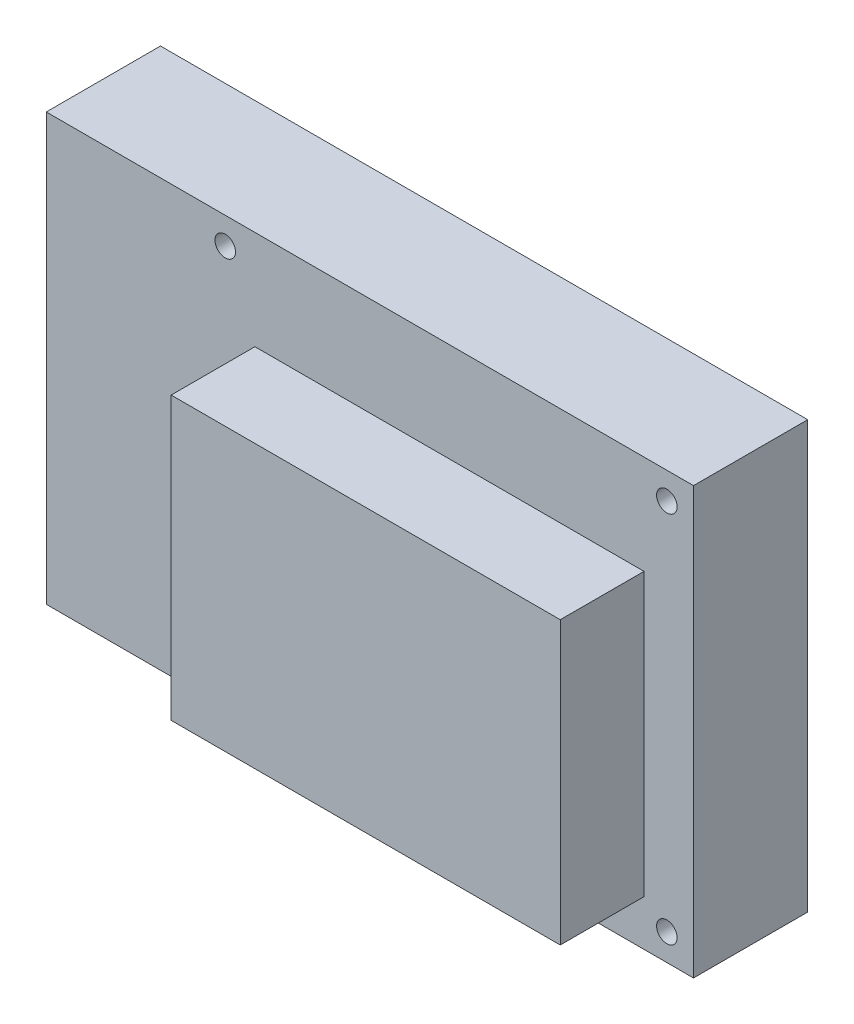
ISO-10303-21;
HEADER;
FILE_DESCRIPTION(('STEP AP214'),'2;1');
FILE_NAME('part.step','',(''),(''),'','','');
FILE_SCHEMA(('AUTOMOTIVE_DESIGN { 1 0 10303 214 1 1 1 1 }'));
ENDSEC;
DATA;
#1=APPLICATION_CONTEXT('core data for automotive mechanical design processes');
#2=APPLICATION_PROTOCOL_DEFINITION('international standard','automotive_design',2000,#1);
#3=PRODUCT_CONTEXT('',#1,'mechanical');
#4=PRODUCT('Part','Part','',(#3));
#5=PRODUCT_RELATED_PRODUCT_CATEGORY('part','',(#4));
#6=PRODUCT_DEFINITION_FORMATION('','',#4);
#7=PRODUCT_DEFINITION_CONTEXT('part definition',#1,'design');
#8=PRODUCT_DEFINITION('design','',#6,#7);
#9=PRODUCT_DEFINITION_SHAPE('','',#8);
#10=(LENGTH_UNIT() NAMED_UNIT(*) SI_UNIT(.MILLI.,.METRE.));
#11=(NAMED_UNIT(*) PLANE_ANGLE_UNIT() SI_UNIT($,.RADIAN.));
#12=(NAMED_UNIT(*) SI_UNIT($,.STERADIAN.) SOLID_ANGLE_UNIT());
#13=UNCERTAINTY_MEASURE_WITH_UNIT(LENGTH_MEASURE(1.E-05),#10,'distance_accuracy_value','');
#14=(GEOMETRIC_REPRESENTATION_CONTEXT(3) GLOBAL_UNCERTAINTY_ASSIGNED_CONTEXT((#13)) GLOBAL_UNIT_ASSIGNED_CONTEXT((#10,
#11,#12)) REPRESENTATION_CONTEXT('',''));
#15=CARTESIAN_POINT('',(0.,0.,0.));
#16=DIRECTION('',(0.,0.,1.));
#17=DIRECTION('',(1.,0.,0.));
#18=AXIS2_PLACEMENT_3D('',#15,#16,#17);
#19=CARTESIAN_POINT('',(0.,0.,15.));
#20=DIRECTION('',(0.,0.,1.));
#21=DIRECTION('',(1.,0.,0.));
#22=AXIS2_PLACEMENT_3D('',#19,#20,#21);
#23=PLANE('',#22);
#24=CARTESIAN_POINT('',(-61.5,3.5,15.));
#25=DIRECTION('',(0.,0.,1.));
#26=DIRECTION('',(1.,0.,0.));
#27=AXIS2_PLACEMENT_3D('',#24,#25,#26);
#28=CIRCLE('',#27,1.35);
#29=CARTESIAN_POINT('',(-60.15,3.5,15.));
#30=VERTEX_POINT('',#29);
#31=EDGE_CURVE('E156',#30,#30,#28,.T.);
#32=ORIENTED_EDGE('',*,*,#31,.F.);
#33=EDGE_LOOP('',(#32));
#34=FACE_BOUND('',#33,.T.);
#35=CARTESIAN_POINT('',(-3.5,52.5,15.));
#36=DIRECTION('',(0.,0.,1.));
#37=DIRECTION('',(1.,0.,0.));
#38=AXIS2_PLACEMENT_3D('',#35,#36,#37);
#39=CIRCLE('',#38,1.34999999999999);
#40=CARTESIAN_POINT('',(-2.15000000000001,52.5,15.));
#41=VERTEX_POINT('',#40);
#42=EDGE_CURVE('E172',#41,#41,#39,.T.);
#43=ORIENTED_EDGE('',*,*,#42,.F.);
#44=EDGE_LOOP('',(#43));
#45=FACE_BOUND('',#44,.T.);
#46=DIRECTION('',(0.,1.,0.));
#47=VECTOR('',#46,1.);
#48=CARTESIAN_POINT('',(0.,0.,15.));
#49=LINE('',#48,#47);
#50=CARTESIAN_POINT('',(0.,0.,15.));
#51=VERTEX_POINT('',#50);
#52=CARTESIAN_POINT('',(0.,56.,15.));
#53=VERTEX_POINT('',#52);
#54=EDGE_CURVE('E180',#51,#53,#49,.T.);
#55=ORIENTED_EDGE('',*,*,#54,.T.);
#56=DIRECTION('',(-1.,0.,0.));
#57=VECTOR('',#56,1.);
#58=CARTESIAN_POINT('',(0.,56.,15.));
#59=LINE('',#58,#57);
#60=CARTESIAN_POINT('',(-85.,56.,15.));
#61=VERTEX_POINT('',#60);
#62=EDGE_CURVE('E92',#53,#61,#59,.T.);
#63=ORIENTED_EDGE('',*,*,#62,.T.);
#64=DIRECTION('',(0.,-1.,0.));
#65=VECTOR('',#64,1.);
#66=CARTESIAN_POINT('',(-85.,0.,15.));
#67=LINE('',#66,#65);
#68=CARTESIAN_POINT('',(-85.,0.,15.));
#69=VERTEX_POINT('',#68);
#70=EDGE_CURVE('E185',#61,#69,#67,.T.);
#71=ORIENTED_EDGE('',*,*,#70,.T.);
#72=DIRECTION('',(1.,0.,0.));
#73=VECTOR('',#72,1.);
#74=CARTESIAN_POINT('',(0.,0.,15.));
#75=LINE('',#74,#73);
#76=EDGE_CURVE('E64',#69,#51,#75,.T.);
#77=ORIENTED_EDGE('',*,*,#76,.T.);
#78=EDGE_LOOP('',(#55,#63,#71,#77));
#79=FACE_BOUND('',#78,.T.);
#80=CARTESIAN_POINT('',(-3.5,3.5,15.));
#81=DIRECTION('',(0.,0.,1.));
#82=DIRECTION('',(1.,0.,0.));
#83=AXIS2_PLACEMENT_3D('',#80,#81,#82);
#84=CIRCLE('',#83,1.35);
#85=CARTESIAN_POINT('',(-2.15,3.5,15.));
#86=VERTEX_POINT('',#85);
#87=EDGE_CURVE('E164',#86,#86,#84,.T.);
#88=ORIENTED_EDGE('',*,*,#87,.F.);
#89=EDGE_LOOP('',(#88));
#90=FACE_BOUND('',#89,.T.);
#91=CARTESIAN_POINT('',(-61.5,52.5,15.));
#92=DIRECTION('',(0.,0.,1.));
#93=DIRECTION('',(1.,0.,0.));
#94=AXIS2_PLACEMENT_3D('',#91,#92,#93);
#95=CIRCLE('',#94,1.35);
#96=CARTESIAN_POINT('',(-60.15,52.5,15.));
#97=VERTEX_POINT('',#96);
#98=EDGE_CURVE('E147',#97,#97,#95,.T.);
#99=ORIENTED_EDGE('',*,*,#98,.F.);
#100=EDGE_LOOP('',(#99));
#101=FACE_BOUND('',#100,.T.);
#102=DIRECTION('',(1.,0.,0.));
#103=VECTOR('',#102,1.);
#104=CARTESIAN_POINT('',(-57.6,5.99999999999999,15.));
#105=LINE('',#104,#103);
#106=CARTESIAN_POINT('',(-57.6,5.99999999999999,15.));
#107=VERTEX_POINT('',#106);
#108=CARTESIAN_POINT('',(-6.5,5.99999999999999,15.));
#109=VERTEX_POINT('',#108);
#110=EDGE_CURVE('E363',#107,#109,#105,.T.);
#111=ORIENTED_EDGE('',*,*,#110,.F.);
#112=DIRECTION('',(0.,-1.,0.));
#113=VECTOR('',#112,1.);
#114=CARTESIAN_POINT('',(-57.6,43.,15.));
#115=LINE('',#114,#113);
#116=CARTESIAN_POINT('',(-57.6,43.,15.));
#117=VERTEX_POINT('',#116);
#118=EDGE_CURVE('E139',#117,#107,#115,.T.);
#119=ORIENTED_EDGE('',*,*,#118,.F.);
#120=DIRECTION('',(-1.,0.,0.));
#121=VECTOR('',#120,1.);
#122=CARTESIAN_POINT('',(-57.6,43.,15.));
#123=LINE('',#122,#121);
#124=CARTESIAN_POINT('',(-6.49999999999999,43.,15.));
#125=VERTEX_POINT('',#124);
#126=EDGE_CURVE('E135',#125,#117,#123,.T.);
#127=ORIENTED_EDGE('',*,*,#126,.F.);
#128=DIRECTION('',(0.,1.,0.));
#129=VECTOR('',#128,1.);
#130=CARTESIAN_POINT('',(-6.49999999999999,43.,15.));
#131=LINE('',#130,#129);
#132=EDGE_CURVE('E359',#109,#125,#131,.T.);
#133=ORIENTED_EDGE('',*,*,#132,.F.);
#134=EDGE_LOOP('',(#111,#119,#127,#133));
#135=FACE_BOUND('',#134,.T.);
#136=ADVANCED_FACE('F39',(#34,#45,#79,#90,#101,#135),#23,.T.);
#137=CARTESIAN_POINT('',(0.,0.,0.));
#138=DIRECTION('',(0.,0.,1.));
#139=DIRECTION('',(1.,0.,0.));
#140=AXIS2_PLACEMENT_3D('',#137,#138,#139);
#141=PLANE('',#140);
#142=DIRECTION('',(0.,1.,0.));
#143=VECTOR('',#142,1.);
#144=CARTESIAN_POINT('',(0.,0.,0.));
#145=LINE('',#144,#143);
#146=CARTESIAN_POINT('',(0.,0.,0.));
#147=VERTEX_POINT('',#146);
#148=CARTESIAN_POINT('',(0.,56.,0.));
#149=VERTEX_POINT('',#148);
#150=EDGE_CURVE('E176',#147,#149,#145,.T.);
#151=ORIENTED_EDGE('',*,*,#150,.F.);
#152=DIRECTION('',(1.,0.,0.));
#153=VECTOR('',#152,1.);
#154=CARTESIAN_POINT('',(0.,0.,0.));
#155=LINE('',#154,#153);
#156=CARTESIAN_POINT('',(-85.,0.,0.));
#157=VERTEX_POINT('',#156);
#158=EDGE_CURVE('E85',#157,#147,#155,.T.);
#159=ORIENTED_EDGE('',*,*,#158,.F.);
#160=DIRECTION('',(0.,-1.,0.));
#161=VECTOR('',#160,1.);
#162=CARTESIAN_POINT('',(-85.,0.,0.));
#163=LINE('',#162,#161);
#164=CARTESIAN_POINT('',(-85.,56.,0.));
#165=VERTEX_POINT('',#164);
#166=EDGE_CURVE('E197',#165,#157,#163,.T.);
#167=ORIENTED_EDGE('',*,*,#166,.F.);
#168=DIRECTION('',(-1.,0.,0.));
#169=VECTOR('',#168,1.);
#170=CARTESIAN_POINT('',(0.,56.,0.));
#171=LINE('',#170,#169);
#172=EDGE_CURVE('E194',#149,#165,#171,.T.);
#173=ORIENTED_EDGE('',*,*,#172,.F.);
#174=EDGE_LOOP('',(#151,#159,#167,#173));
#175=FACE_BOUND('',#174,.T.);
#176=CARTESIAN_POINT('',(-3.5,52.5,0.));
#177=DIRECTION('',(0.,0.,1.));
#178=DIRECTION('',(1.,0.,0.));
#179=AXIS2_PLACEMENT_3D('',#176,#177,#178);
#180=CIRCLE('',#179,1.34999999999999);
#181=CARTESIAN_POINT('',(-2.15000000000001,52.5,0.));
#182=VERTEX_POINT('',#181);
#183=EDGE_CURVE('E168',#182,#182,#180,.T.);
#184=ORIENTED_EDGE('',*,*,#183,.T.);
#185=EDGE_LOOP('',(#184));
#186=FACE_BOUND('',#185,.T.);
#187=CARTESIAN_POINT('',(-3.5,3.5,0.));
#188=DIRECTION('',(0.,0.,1.));
#189=DIRECTION('',(1.,0.,0.));
#190=AXIS2_PLACEMENT_3D('',#187,#188,#189);
#191=CIRCLE('',#190,1.35);
#192=CARTESIAN_POINT('',(-2.15,3.5,0.));
#193=VERTEX_POINT('',#192);
#194=EDGE_CURVE('E160',#193,#193,#191,.T.);
#195=ORIENTED_EDGE('',*,*,#194,.T.);
#196=EDGE_LOOP('',(#195));
#197=FACE_BOUND('',#196,.T.);
#198=CARTESIAN_POINT('',(-61.5,3.5,0.));
#199=DIRECTION('',(0.,0.,1.));
#200=DIRECTION('',(1.,0.,0.));
#201=AXIS2_PLACEMENT_3D('',#198,#199,#200);
#202=CIRCLE('',#201,1.35);
#203=CARTESIAN_POINT('',(-60.15,3.5,0.));
#204=VERTEX_POINT('',#203);
#205=EDGE_CURVE('E154',#204,#204,#202,.T.);
#206=ORIENTED_EDGE('',*,*,#205,.T.);
#207=EDGE_LOOP('',(#206));
#208=FACE_BOUND('',#207,.T.);
#209=CARTESIAN_POINT('',(-61.5,52.5,0.));
#210=DIRECTION('',(0.,0.,1.));
#211=DIRECTION('',(1.,0.,0.));
#212=AXIS2_PLACEMENT_3D('',#209,#210,#211);
#213=CIRCLE('',#212,1.35);
#214=CARTESIAN_POINT('',(-60.15,52.5,0.));
#215=VERTEX_POINT('',#214);
#216=EDGE_CURVE('E142',#215,#215,#213,.T.);
#217=ORIENTED_EDGE('',*,*,#216,.T.);
#218=EDGE_LOOP('',(#217));
#219=FACE_BOUND('',#218,.T.);
#220=ADVANCED_FACE('F215',(#175,#186,#197,#208,#219),#141,.F.);
#221=CARTESIAN_POINT('',(0.,0.,15.));
#222=DIRECTION('',(-1.,0.,0.));
#223=DIRECTION('',(0.,0.,1.));
#224=AXIS2_PLACEMENT_3D('',#221,#222,#223);
#225=PLANE('',#224);
#226=ORIENTED_EDGE('',*,*,#150,.T.);
#227=DIRECTION('',(0.,0.,-1.));
#228=VECTOR('',#227,1.);
#229=CARTESIAN_POINT('',(0.,56.,15.));
#230=LINE('',#229,#228);
#231=EDGE_CURVE('E11',#53,#149,#230,.T.);
#232=ORIENTED_EDGE('',*,*,#231,.F.);
#233=ORIENTED_EDGE('',*,*,#54,.F.);
#234=DIRECTION('',(0.,0.,-1.));
#235=VECTOR('',#234,1.);
#236=CARTESIAN_POINT('',(0.,0.,15.));
#237=LINE('',#236,#235);
#238=EDGE_CURVE('E190',#51,#147,#237,.T.);
#239=ORIENTED_EDGE('',*,*,#238,.T.);
#240=EDGE_LOOP('',(#226,#232,#233,#239));
#241=FACE_BOUND('',#240,.T.);
#242=ADVANCED_FACE('F41',(#241),#225,.F.);
#243=CARTESIAN_POINT('',(0.,56.,15.));
#244=DIRECTION('',(0.,-1.,0.));
#245=DIRECTION('',(1.,0.,0.));
#246=AXIS2_PLACEMENT_3D('',#243,#244,#245);
#247=PLANE('',#246);
#248=ORIENTED_EDGE('',*,*,#172,.T.);
#249=DIRECTION('',(0.,0.,-1.));
#250=VECTOR('',#249,1.);
#251=CARTESIAN_POINT('',(-85.,56.,15.));
#252=LINE('',#251,#250);
#253=EDGE_CURVE('E48',#61,#165,#252,.T.);
#254=ORIENTED_EDGE('',*,*,#253,.F.);
#255=ORIENTED_EDGE('',*,*,#62,.F.);
#256=ORIENTED_EDGE('',*,*,#231,.T.);
#257=EDGE_LOOP('',(#248,#254,#255,#256));
#258=FACE_BOUND('',#257,.T.);
#259=ADVANCED_FACE('F231',(#258),#247,.F.);
#260=CARTESIAN_POINT('',(-85.,0.,15.));
#261=DIRECTION('',(1.,0.,0.));
#262=DIRECTION('',(0.,0.,-1.));
#263=AXIS2_PLACEMENT_3D('',#260,#261,#262);
#264=PLANE('',#263);
#265=ORIENTED_EDGE('',*,*,#166,.T.);
#266=DIRECTION('',(0.,0.,-1.));
#267=VECTOR('',#266,1.);
#268=CARTESIAN_POINT('',(-85.,0.,15.));
#269=LINE('',#268,#267);
#270=EDGE_CURVE('E204',#69,#157,#269,.T.);
#271=ORIENTED_EDGE('',*,*,#270,.F.);
#272=ORIENTED_EDGE('',*,*,#70,.F.);
#273=ORIENTED_EDGE('',*,*,#253,.T.);
#274=EDGE_LOOP('',(#265,#271,#272,#273));
#275=FACE_BOUND('',#274,.T.);
#276=ADVANCED_FACE('F211',(#275),#264,.F.);
#277=CARTESIAN_POINT('',(0.,0.,15.));
#278=DIRECTION('',(0.,1.,0.));
#279=DIRECTION('',(0.,0.,1.));
#280=AXIS2_PLACEMENT_3D('',#277,#278,#279);
#281=PLANE('',#280);
#282=ORIENTED_EDGE('',*,*,#158,.T.);
#283=ORIENTED_EDGE('',*,*,#238,.F.);
#284=ORIENTED_EDGE('',*,*,#76,.F.);
#285=ORIENTED_EDGE('',*,*,#270,.T.);
#286=EDGE_LOOP('',(#282,#283,#284,#285));
#287=FACE_BOUND('',#286,.T.);
#288=ADVANCED_FACE('F220',(#287),#281,.F.);
#289=CARTESIAN_POINT('',(-3.5,52.5,15.));
#290=DIRECTION('',(0.,0.,-1.));
#291=DIRECTION('',(-1.,0.,0.));
#292=AXIS2_PLACEMENT_3D('',#289,#290,#291);
#293=CYLINDRICAL_SURFACE('',#292,1.34999999999999);
#294=ORIENTED_EDGE('',*,*,#42,.T.);
#295=EDGE_LOOP('',(#294));
#296=FACE_BOUND('',#295,.T.);
#297=ORIENTED_EDGE('',*,*,#183,.F.);
#298=EDGE_LOOP('',(#297));
#299=FACE_BOUND('',#298,.T.);
#300=ADVANCED_FACE('F222',(#296,#299),#293,.F.);
#301=CARTESIAN_POINT('',(-3.5,3.5,15.));
#302=DIRECTION('',(0.,0.,-1.));
#303=DIRECTION('',(-1.,0.,0.));
#304=AXIS2_PLACEMENT_3D('',#301,#302,#303);
#305=CYLINDRICAL_SURFACE('',#304,1.35);
#306=ORIENTED_EDGE('',*,*,#87,.T.);
#307=EDGE_LOOP('',(#306));
#308=FACE_BOUND('',#307,.T.);
#309=ORIENTED_EDGE('',*,*,#194,.F.);
#310=EDGE_LOOP('',(#309));
#311=FACE_BOUND('',#310,.T.);
#312=ADVANCED_FACE('F228',(#308,#311),#305,.F.);
#313=CARTESIAN_POINT('',(-61.5,3.5,15.));
#314=DIRECTION('',(0.,0.,-1.));
#315=DIRECTION('',(-1.,0.,0.));
#316=AXIS2_PLACEMENT_3D('',#313,#314,#315);
#317=CYLINDRICAL_SURFACE('',#316,1.35);
#318=ORIENTED_EDGE('',*,*,#31,.T.);
#319=EDGE_LOOP('',(#318));
#320=FACE_BOUND('',#319,.T.);
#321=ORIENTED_EDGE('',*,*,#205,.F.);
#322=EDGE_LOOP('',(#321));
#323=FACE_BOUND('',#322,.T.);
#324=ADVANCED_FACE('F245',(#320,#323),#317,.F.);
#325=CARTESIAN_POINT('',(-61.5,52.5,15.));
#326=DIRECTION('',(0.,0.,-1.));
#327=DIRECTION('',(-1.,0.,0.));
#328=AXIS2_PLACEMENT_3D('',#325,#326,#327);
#329=CYLINDRICAL_SURFACE('',#328,1.35);
#330=ORIENTED_EDGE('',*,*,#98,.T.);
#331=EDGE_LOOP('',(#330));
#332=FACE_BOUND('',#331,.T.);
#333=ORIENTED_EDGE('',*,*,#216,.F.);
#334=EDGE_LOOP('',(#333));
#335=FACE_BOUND('',#334,.T.);
#336=ADVANCED_FACE('F249',(#332,#335),#329,.F.);
#337=CARTESIAN_POINT('',(-57.6,43.,26.));
#338=DIRECTION('',(1.,0.,0.));
#339=DIRECTION('',(0.,0.,-1.));
#340=AXIS2_PLACEMENT_3D('',#337,#338,#339);
#341=PLANE('',#340);
#342=ORIENTED_EDGE('',*,*,#118,.T.);
#343=DIRECTION('',(0.,0.,-1.));
#344=VECTOR('',#343,1.);
#345=CARTESIAN_POINT('',(-57.6,5.99999999999999,26.));
#346=LINE('',#345,#344);
#347=CARTESIAN_POINT('',(-57.6,5.99999999999999,26.));
#348=VERTEX_POINT('',#347);
#349=EDGE_CURVE('E118',#348,#107,#346,.T.);
#350=ORIENTED_EDGE('',*,*,#349,.F.);
#351=DIRECTION('',(0.,-1.,0.));
#352=VECTOR('',#351,1.);
#353=CARTESIAN_POINT('',(-57.6,43.,26.));
#354=LINE('',#353,#352);
#355=CARTESIAN_POINT('',(-57.6,43.,26.));
#356=VERTEX_POINT('',#355);
#357=EDGE_CURVE('E126',#356,#348,#354,.T.);
#358=ORIENTED_EDGE('',*,*,#357,.F.);
#359=DIRECTION('',(0.,0.,-1.));
#360=VECTOR('',#359,1.);
#361=CARTESIAN_POINT('',(-57.6,43.,26.));
#362=LINE('',#361,#360);
#363=EDGE_CURVE('E355',#356,#117,#362,.T.);
#364=ORIENTED_EDGE('',*,*,#363,.T.);
#365=EDGE_LOOP('',(#342,#350,#358,#364));
#366=FACE_BOUND('',#365,.T.);
#367=ADVANCED_FACE('F137',(#366),#341,.F.);
#368=CARTESIAN_POINT('',(-57.6,5.99999999999999,26.));
#369=DIRECTION('',(0.,1.,0.));
#370=DIRECTION('',(0.,0.,1.));
#371=AXIS2_PLACEMENT_3D('',#368,#369,#370);
#372=PLANE('',#371);
#373=ORIENTED_EDGE('',*,*,#110,.T.);
#374=DIRECTION('',(0.,0.,-1.));
#375=VECTOR('',#374,1.);
#376=CARTESIAN_POINT('',(-6.5,5.99999999999999,26.));
#377=LINE('',#376,#375);
#378=CARTESIAN_POINT('',(-6.5,5.99999999999999,26.));
#379=VERTEX_POINT('',#378);
#380=EDGE_CURVE('E121',#379,#109,#377,.T.);
#381=ORIENTED_EDGE('',*,*,#380,.F.);
#382=DIRECTION('',(1.,0.,0.));
#383=VECTOR('',#382,1.);
#384=CARTESIAN_POINT('',(-57.6,5.99999999999999,26.));
#385=LINE('',#384,#383);
#386=EDGE_CURVE('E114',#348,#379,#385,.T.);
#387=ORIENTED_EDGE('',*,*,#386,.F.);
#388=ORIENTED_EDGE('',*,*,#349,.T.);
#389=EDGE_LOOP('',(#373,#381,#387,#388));
#390=FACE_BOUND('',#389,.T.);
#391=ADVANCED_FACE('F116',(#390),#372,.F.);
#392=CARTESIAN_POINT('',(-6.49999999999999,43.,26.));
#393=DIRECTION('',(-1.,0.,0.));
#394=DIRECTION('',(0.,-1.,0.));
#395=AXIS2_PLACEMENT_3D('',#392,#393,#394);
#396=PLANE('',#395);
#397=ORIENTED_EDGE('',*,*,#132,.T.);
#398=DIRECTION('',(0.,0.,-1.));
#399=VECTOR('',#398,1.);
#400=CARTESIAN_POINT('',(-6.49999999999999,43.,26.));
#401=LINE('',#400,#399);
#402=CARTESIAN_POINT('',(-6.49999999999999,43.,26.));
#403=VERTEX_POINT('',#402);
#404=EDGE_CURVE('E55',#403,#125,#401,.T.);
#405=ORIENTED_EDGE('',*,*,#404,.F.);
#406=DIRECTION('',(0.,1.,0.));
#407=VECTOR('',#406,1.);
#408=CARTESIAN_POINT('',(-6.49999999999999,43.,26.));
#409=LINE('',#408,#407);
#410=EDGE_CURVE('E125',#379,#403,#409,.T.);
#411=ORIENTED_EDGE('',*,*,#410,.F.);
#412=ORIENTED_EDGE('',*,*,#380,.T.);
#413=EDGE_LOOP('',(#397,#405,#411,#412));
#414=FACE_BOUND('',#413,.T.);
#415=ADVANCED_FACE('F258',(#414),#396,.F.);
#416=CARTESIAN_POINT('',(-57.6,43.,26.));
#417=DIRECTION('',(0.,-1.,0.));
#418=DIRECTION('',(1.,0.,0.));
#419=AXIS2_PLACEMENT_3D('',#416,#417,#418);
#420=PLANE('',#419);
#421=ORIENTED_EDGE('',*,*,#126,.T.);
#422=ORIENTED_EDGE('',*,*,#363,.F.);
#423=DIRECTION('',(-1.,0.,0.));
#424=VECTOR('',#423,1.);
#425=CARTESIAN_POINT('',(-57.6,43.,26.));
#426=LINE('',#425,#424);
#427=EDGE_CURVE('E130',#403,#356,#426,.T.);
#428=ORIENTED_EDGE('',*,*,#427,.F.);
#429=ORIENTED_EDGE('',*,*,#404,.T.);
#430=EDGE_LOOP('',(#421,#422,#428,#429));
#431=FACE_BOUND('',#430,.T.);
#432=ADVANCED_FACE('F261',(#431),#420,.F.);
#433=CARTESIAN_POINT('',(0.,0.,26.));
#434=DIRECTION('',(0.,0.,1.));
#435=DIRECTION('',(1.,0.,0.));
#436=AXIS2_PLACEMENT_3D('',#433,#434,#435);
#437=PLANE('',#436);
#438=ORIENTED_EDGE('',*,*,#357,.T.);
#439=ORIENTED_EDGE('',*,*,#386,.T.);
#440=ORIENTED_EDGE('',*,*,#410,.T.);
#441=ORIENTED_EDGE('',*,*,#427,.T.);
#442=EDGE_LOOP('',(#438,#439,#440,#441));
#443=FACE_BOUND('',#442,.T.);
#444=ADVANCED_FACE('F129',(#443),#437,.T.);
#445=CLOSED_SHELL('',(#136,#220,#242,#259,#276,#288,#300,#312,#324,#336,#367,#391,#415,#432,#444));
#446=MANIFOLD_SOLID_BREP('B2',#445);
#447=ADVANCED_BREP_SHAPE_REPRESENTATION('',(#18,#446),#14);
#448=SHAPE_DEFINITION_REPRESENTATION(#9,#447);
ENDSEC;
END-ISO-10303-21;
